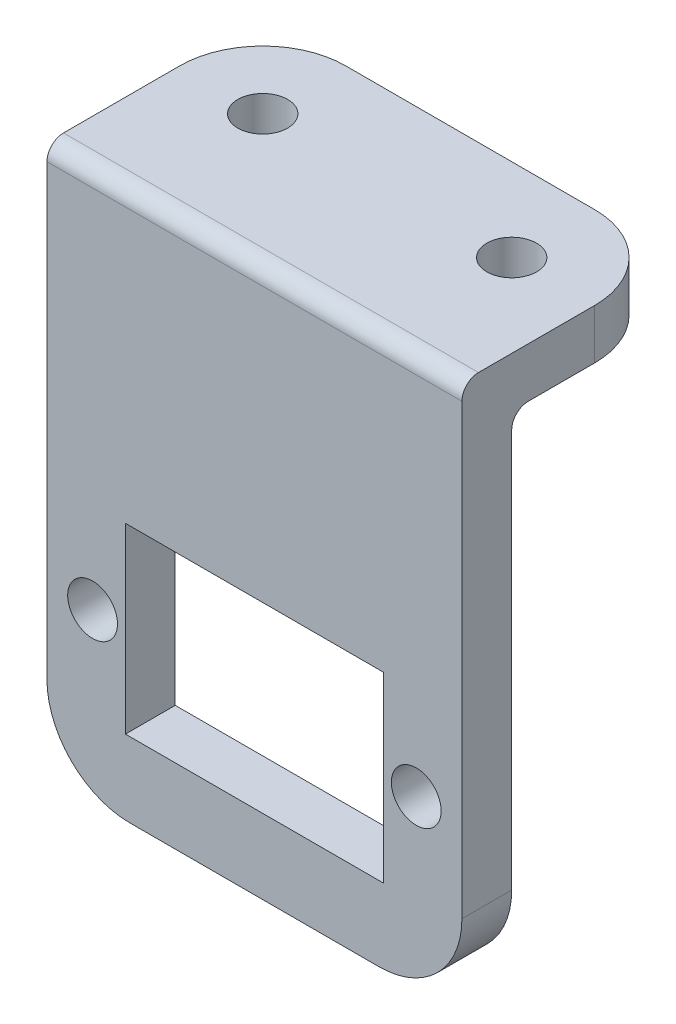
ISO-10303-21;
HEADER;
FILE_DESCRIPTION(('STEP AP214'),'2;1');
FILE_NAME('part.step','',(''),(''),'','','');
FILE_SCHEMA(('AUTOMOTIVE_DESIGN { 1 0 10303 214 1 1 1 1 }'));
ENDSEC;
DATA;
#1=APPLICATION_CONTEXT('core data for automotive mechanical design processes');
#2=APPLICATION_PROTOCOL_DEFINITION('international standard','automotive_design',2000,#1);
#3=PRODUCT_CONTEXT('',#1,'mechanical');
#4=PRODUCT('Part','Part','',(#3));
#5=PRODUCT_RELATED_PRODUCT_CATEGORY('part','',(#4));
#6=PRODUCT_DEFINITION_FORMATION('','',#4);
#7=PRODUCT_DEFINITION_CONTEXT('part definition',#1,'design');
#8=PRODUCT_DEFINITION('design','',#6,#7);
#9=PRODUCT_DEFINITION_SHAPE('','',#8);
#10=(LENGTH_UNIT() NAMED_UNIT(*) SI_UNIT(.MILLI.,.METRE.));
#11=(NAMED_UNIT(*) PLANE_ANGLE_UNIT() SI_UNIT($,.RADIAN.));
#12=(NAMED_UNIT(*) SI_UNIT($,.STERADIAN.) SOLID_ANGLE_UNIT());
#13=UNCERTAINTY_MEASURE_WITH_UNIT(LENGTH_MEASURE(1.E-05),#10,'distance_accuracy_value','');
#14=(GEOMETRIC_REPRESENTATION_CONTEXT(3) GLOBAL_UNCERTAINTY_ASSIGNED_CONTEXT((#13)) GLOBAL_UNIT_ASSIGNED_CONTEXT((#10,
#11,#12)) REPRESENTATION_CONTEXT('',''));
#15=CARTESIAN_POINT('',(0.,0.,0.));
#16=DIRECTION('',(0.,0.,1.));
#17=DIRECTION('',(1.,0.,0.));
#18=AXIS2_PLACEMENT_3D('',#15,#16,#17);
#19=CARTESIAN_POINT('',(0.,0.,-3.));
#20=DIRECTION('',(0.,0.,1.));
#21=DIRECTION('',(-1.,0.,0.));
#22=AXIS2_PLACEMENT_3D('',#19,#20,#21);
#23=PLANE('',#22);
#24=CARTESIAN_POINT('',(9.75,-5.,-3.));
#25=DIRECTION('',(0.,0.,1.));
#26=DIRECTION('',(1.,0.,0.));
#27=AXIS2_PLACEMENT_3D('',#24,#25,#26);
#28=CIRCLE('',#27,1.5);
#29=CARTESIAN_POINT('',(11.25,-5.,-3.));
#30=VERTEX_POINT('',#29);
#31=EDGE_CURVE('E199',#30,#30,#28,.T.);
#32=ORIENTED_EDGE('',*,*,#31,.T.);
#33=EDGE_LOOP('',(#32));
#34=FACE_BOUND('',#33,.T.);
#35=CARTESIAN_POINT('',(-9.75,-5.,-3.));
#36=DIRECTION('',(0.,0.,1.));
#37=DIRECTION('',(1.,0.,0.));
#38=AXIS2_PLACEMENT_3D('',#35,#36,#37);
#39=CIRCLE('',#38,1.5);
#40=CARTESIAN_POINT('',(-8.25,-5.,-3.));
#41=VERTEX_POINT('',#40);
#42=EDGE_CURVE('E205',#41,#41,#39,.T.);
#43=ORIENTED_EDGE('',*,*,#42,.T.);
#44=EDGE_LOOP('',(#43));
#45=FACE_BOUND('',#44,.T.);
#46=DIRECTION('',(1.,0.,0.));
#47=VECTOR('',#46,1.);
#48=CARTESIAN_POINT('',(-7.77000000000001,-10.5,-3.));
#49=LINE('',#48,#47);
#50=CARTESIAN_POINT('',(-7.77000000000001,-10.5,-3.));
#51=VERTEX_POINT('',#50);
#52=CARTESIAN_POINT('',(7.76999999999999,-10.5,-3.));
#53=VERTEX_POINT('',#52);
#54=EDGE_CURVE('E158',#51,#53,#49,.T.);
#55=ORIENTED_EDGE('',*,*,#54,.T.);
#56=DIRECTION('',(0.,1.,0.));
#57=VECTOR('',#56,1.);
#58=CARTESIAN_POINT('',(7.76999999999999,0.500000000000002,-3.));
#59=LINE('',#58,#57);
#60=CARTESIAN_POINT('',(7.76999999999999,0.500000000000002,-3.));
#61=VERTEX_POINT('',#60);
#62=EDGE_CURVE('E181',#53,#61,#59,.T.);
#63=ORIENTED_EDGE('',*,*,#62,.T.);
#64=DIRECTION('',(-1.,0.,0.));
#65=VECTOR('',#64,1.);
#66=CARTESIAN_POINT('',(-7.77000000000001,0.500000000000002,-3.));
#67=LINE('',#66,#65);
#68=CARTESIAN_POINT('',(-7.77000000000001,0.500000000000002,-3.));
#69=VERTEX_POINT('',#68);
#70=EDGE_CURVE('E178',#61,#69,#67,.T.);
#71=ORIENTED_EDGE('',*,*,#70,.T.);
#72=DIRECTION('',(0.,-1.,0.));
#73=VECTOR('',#72,1.);
#74=CARTESIAN_POINT('',(-7.77000000000001,0.500000000000002,-3.));
#75=LINE('',#74,#73);
#76=EDGE_CURVE('E189',#69,#51,#75,.T.);
#77=ORIENTED_EDGE('',*,*,#76,.T.);
#78=EDGE_LOOP('',(#55,#63,#71,#77));
#79=FACE_BOUND('',#78,.T.);
#80=DIRECTION('',(0.,1.,0.));
#81=VECTOR('',#80,1.);
#82=CARTESIAN_POINT('',(12.5,-15.,-3.));
#83=LINE('',#82,#81);
#84=CARTESIAN_POINT('',(12.5,-10.,-3.));
#85=VERTEX_POINT('',#84);
#86=CARTESIAN_POINT('',(12.5,14.,-3.));
#87=VERTEX_POINT('',#86);
#88=EDGE_CURVE('E211',#85,#87,#83,.T.);
#89=ORIENTED_EDGE('',*,*,#88,.F.);
#90=CARTESIAN_POINT('',(7.5,-10.,-3.));
#91=DIRECTION('',(0.,0.,-1.));
#92=DIRECTION('',(-1.,0.,0.));
#93=AXIS2_PLACEMENT_3D('',#90,#91,#92);
#94=CIRCLE('',#93,5.);
#95=CARTESIAN_POINT('',(7.5,-15.,-3.));
#96=VERTEX_POINT('',#95);
#97=EDGE_CURVE('E243',#96,#85,#94,.F.);
#98=ORIENTED_EDGE('',*,*,#97,.F.);
#99=DIRECTION('',(1.,0.,0.));
#100=VECTOR('',#99,1.);
#101=CARTESIAN_POINT('',(-12.5,-15.,-3.));
#102=LINE('',#101,#100);
#103=CARTESIAN_POINT('',(-7.5,-15.,-3.));
#104=VERTEX_POINT('',#103);
#105=EDGE_CURVE('E218',#104,#96,#102,.T.);
#106=ORIENTED_EDGE('',*,*,#105,.F.);
#107=CARTESIAN_POINT('',(-7.5,-10.,-3.));
#108=DIRECTION('',(0.,0.,-1.));
#109=DIRECTION('',(-1.,0.,0.));
#110=AXIS2_PLACEMENT_3D('',#107,#108,#109);
#111=CIRCLE('',#110,5.);
#112=CARTESIAN_POINT('',(-12.5,-10.,-3.));
#113=VERTEX_POINT('',#112);
#114=EDGE_CURVE('E240',#113,#104,#111,.F.);
#115=ORIENTED_EDGE('',*,*,#114,.F.);
#116=DIRECTION('',(0.,-1.,0.));
#117=VECTOR('',#116,1.);
#118=CARTESIAN_POINT('',(-12.5,-15.,-3.));
#119=LINE('',#118,#117);
#120=CARTESIAN_POINT('',(-12.5,14.,-3.));
#121=VERTEX_POINT('',#120);
#122=EDGE_CURVE('E214',#121,#113,#119,.T.);
#123=ORIENTED_EDGE('',*,*,#122,.F.);
#124=DIRECTION('',(1.,0.,0.));
#125=VECTOR('',#124,1.);
#126=CARTESIAN_POINT('',(-12.5,14.,-3.));
#127=LINE('',#126,#125);
#128=EDGE_CURVE('E270',#87,#121,#127,.F.);
#129=ORIENTED_EDGE('',*,*,#128,.F.);
#130=EDGE_LOOP('',(#89,#98,#106,#115,#123,#129));
#131=FACE_BOUND('',#130,.T.);
#132=ADVANCED_FACE('F39',(#34,#45,#79,#131),#23,.F.);
#133=CARTESIAN_POINT('',(0.,0.,0.));
#134=DIRECTION('',(0.,0.,1.));
#135=DIRECTION('',(-1.,0.,0.));
#136=AXIS2_PLACEMENT_3D('',#133,#134,#135);
#137=PLANE('',#136);
#138=DIRECTION('',(0.,-1.,0.));
#139=VECTOR('',#138,1.);
#140=CARTESIAN_POINT('',(-7.77000000000001,0.500000000000002,0.));
#141=LINE('',#140,#139);
#142=CARTESIAN_POINT('',(-7.77000000000001,0.500000000000002,0.));
#143=VERTEX_POINT('',#142);
#144=CARTESIAN_POINT('',(-7.77000000000001,-10.5,0.));
#145=VERTEX_POINT('',#144);
#146=EDGE_CURVE('E171',#143,#145,#141,.T.);
#147=ORIENTED_EDGE('',*,*,#146,.F.);
#148=DIRECTION('',(-1.,0.,0.));
#149=VECTOR('',#148,1.);
#150=CARTESIAN_POINT('',(-7.77000000000001,0.500000000000002,0.));
#151=LINE('',#150,#149);
#152=CARTESIAN_POINT('',(7.76999999999999,0.500000000000002,0.));
#153=VERTEX_POINT('',#152);
#154=EDGE_CURVE('E164',#153,#143,#151,.T.);
#155=ORIENTED_EDGE('',*,*,#154,.F.);
#156=DIRECTION('',(0.,1.,0.));
#157=VECTOR('',#156,1.);
#158=CARTESIAN_POINT('',(7.76999999999999,0.500000000000002,0.));
#159=LINE('',#158,#157);
#160=CARTESIAN_POINT('',(7.76999999999999,-10.5,0.));
#161=VERTEX_POINT('',#160);
#162=EDGE_CURVE('E173',#161,#153,#159,.T.);
#163=ORIENTED_EDGE('',*,*,#162,.F.);
#164=DIRECTION('',(1.,0.,0.));
#165=VECTOR('',#164,1.);
#166=CARTESIAN_POINT('',(-7.77000000000001,-10.5,0.));
#167=LINE('',#166,#165);
#168=EDGE_CURVE('E155',#145,#161,#167,.T.);
#169=ORIENTED_EDGE('',*,*,#168,.F.);
#170=EDGE_LOOP('',(#147,#155,#163,#169));
#171=FACE_BOUND('',#170,.T.);
#172=CARTESIAN_POINT('',(-9.75,-5.,0.));
#173=DIRECTION('',(0.,0.,1.));
#174=DIRECTION('',(1.,0.,0.));
#175=AXIS2_PLACEMENT_3D('',#172,#173,#174);
#176=CIRCLE('',#175,1.5);
#177=CARTESIAN_POINT('',(-8.25,-5.,0.));
#178=VERTEX_POINT('',#177);
#179=EDGE_CURVE('E202',#178,#178,#176,.T.);
#180=ORIENTED_EDGE('',*,*,#179,.F.);
#181=EDGE_LOOP('',(#180));
#182=FACE_BOUND('',#181,.T.);
#183=DIRECTION('',(0.,-1.,0.));
#184=VECTOR('',#183,1.);
#185=CARTESIAN_POINT('',(-12.5,-15.,0.));
#186=LINE('',#185,#184);
#187=CARTESIAN_POINT('',(-12.5,17.,0.));
#188=VERTEX_POINT('',#187);
#189=CARTESIAN_POINT('',(-12.5,-10.,0.));
#190=VERTEX_POINT('',#189);
#191=EDGE_CURVE('E224',#188,#190,#186,.T.);
#192=ORIENTED_EDGE('',*,*,#191,.T.);
#193=CARTESIAN_POINT('',(-7.5,-10.,0.));
#194=DIRECTION('',(0.,0.,-1.));
#195=DIRECTION('',(-1.,0.,0.));
#196=AXIS2_PLACEMENT_3D('',#193,#194,#195);
#197=CIRCLE('',#196,5.);
#198=CARTESIAN_POINT('',(-7.5,-15.,0.));
#199=VERTEX_POINT('',#198);
#200=EDGE_CURVE('E230',#199,#190,#197,.T.);
#201=ORIENTED_EDGE('',*,*,#200,.F.);
#202=DIRECTION('',(1.,0.,0.));
#203=VECTOR('',#202,1.);
#204=CARTESIAN_POINT('',(-12.5,-15.,0.));
#205=LINE('',#204,#203);
#206=CARTESIAN_POINT('',(7.5,-15.,0.));
#207=VERTEX_POINT('',#206);
#208=EDGE_CURVE('E215',#199,#207,#205,.T.);
#209=ORIENTED_EDGE('',*,*,#208,.T.);
#210=CARTESIAN_POINT('',(7.5,-10.,0.));
#211=DIRECTION('',(0.,0.,-1.));
#212=DIRECTION('',(-1.,0.,0.));
#213=AXIS2_PLACEMENT_3D('',#210,#211,#212);
#214=CIRCLE('',#213,5.);
#215=CARTESIAN_POINT('',(12.5,-10.,0.));
#216=VERTEX_POINT('',#215);
#217=EDGE_CURVE('E233',#216,#207,#214,.T.);
#218=ORIENTED_EDGE('',*,*,#217,.F.);
#219=DIRECTION('',(0.,1.,0.));
#220=VECTOR('',#219,1.);
#221=CARTESIAN_POINT('',(12.5,-15.,0.));
#222=LINE('',#221,#220);
#223=CARTESIAN_POINT('',(12.5,17.,0.));
#224=VERTEX_POINT('',#223);
#225=EDGE_CURVE('E208',#216,#224,#222,.T.);
#226=ORIENTED_EDGE('',*,*,#225,.T.);
#227=DIRECTION('',(-1.,0.,0.));
#228=VECTOR('',#227,1.);
#229=CARTESIAN_POINT('',(0.,17.,0.));
#230=LINE('',#229,#228);
#231=EDGE_CURVE('E47',#188,#224,#230,.F.);
#232=ORIENTED_EDGE('',*,*,#231,.F.);
#233=EDGE_LOOP('',(#192,#201,#209,#218,#226,#232));
#234=FACE_BOUND('',#233,.T.);
#235=CARTESIAN_POINT('',(9.75,-5.,0.));
#236=DIRECTION('',(0.,0.,1.));
#237=DIRECTION('',(1.,0.,0.));
#238=AXIS2_PLACEMENT_3D('',#235,#236,#237);
#239=CIRCLE('',#238,1.5);
#240=CARTESIAN_POINT('',(11.25,-5.,0.));
#241=VERTEX_POINT('',#240);
#242=EDGE_CURVE('E195',#241,#241,#239,.T.);
#243=ORIENTED_EDGE('',*,*,#242,.F.);
#244=EDGE_LOOP('',(#243));
#245=FACE_BOUND('',#244,.T.);
#246=ADVANCED_FACE('F168',(#171,#182,#234,#245),#137,.T.);
#247=CARTESIAN_POINT('',(12.5,-15.,-3.));
#248=DIRECTION('',(-1.,0.,0.));
#249=DIRECTION('',(0.,0.,-1.));
#250=AXIS2_PLACEMENT_3D('',#247,#248,#249);
#251=PLANE('',#250);
#252=ORIENTED_EDGE('',*,*,#225,.F.);
#253=DIRECTION('',(0.,0.,1.));
#254=VECTOR('',#253,1.);
#255=CARTESIAN_POINT('',(12.5,-10.,-3.));
#256=LINE('',#255,#254);
#257=EDGE_CURVE('E221',#85,#216,#256,.T.);
#258=ORIENTED_EDGE('',*,*,#257,.F.);
#259=ORIENTED_EDGE('',*,*,#88,.T.);
#260=CARTESIAN_POINT('',(12.5,14.,-4.));
#261=DIRECTION('',(1.,0.,0.));
#262=DIRECTION('',(0.,0.,-1.));
#263=AXIS2_PLACEMENT_3D('',#260,#261,#262);
#264=CIRCLE('',#263,1.);
#265=CARTESIAN_POINT('',(12.5,15.,-4.));
#266=VERTEX_POINT('',#265);
#267=EDGE_CURVE('E273',#266,#87,#264,.T.);
#268=ORIENTED_EDGE('',*,*,#267,.F.);
#269=DIRECTION('',(0.,0.,1.));
#270=VECTOR('',#269,1.);
#271=CARTESIAN_POINT('',(12.5,15.,-13.));
#272=LINE('',#271,#270);
#273=CARTESIAN_POINT('',(12.5,15.,-8.));
#274=VERTEX_POINT('',#273);
#275=EDGE_CURVE('E301',#274,#266,#272,.T.);
#276=ORIENTED_EDGE('',*,*,#275,.F.);
#277=DIRECTION('',(0.,1.,0.));
#278=VECTOR('',#277,1.);
#279=CARTESIAN_POINT('',(12.5,15.,-8.));
#280=LINE('',#279,#278);
#281=CARTESIAN_POINT('',(12.5,18.,-8.));
#282=VERTEX_POINT('',#281);
#283=EDGE_CURVE('E252',#282,#274,#280,.F.);
#284=ORIENTED_EDGE('',*,*,#283,.F.);
#285=DIRECTION('',(0.,0.,1.));
#286=VECTOR('',#285,1.);
#287=CARTESIAN_POINT('',(12.5,18.,-3.));
#288=LINE('',#287,#286);
#289=CARTESIAN_POINT('',(12.5,18.,-1.));
#290=VERTEX_POINT('',#289);
#291=EDGE_CURVE('E306',#282,#290,#288,.T.);
#292=ORIENTED_EDGE('',*,*,#291,.T.);
#293=CARTESIAN_POINT('',(12.5,17.,-1.));
#294=DIRECTION('',(1.,0.,0.));
#295=DIRECTION('',(0.,0.,-1.));
#296=AXIS2_PLACEMENT_3D('',#293,#294,#295);
#297=CIRCLE('',#296,1.);
#298=EDGE_CURVE('E11',#224,#290,#297,.F.);
#299=ORIENTED_EDGE('',*,*,#298,.F.);
#300=EDGE_LOOP('',(#252,#258,#259,#268,#276,#284,#292,#299));
#301=FACE_BOUND('',#300,.T.);
#302=ADVANCED_FACE('F284',(#301),#251,.F.);
#303=CARTESIAN_POINT('',(-12.5,-15.,-3.));
#304=DIRECTION('',(1.,0.,0.));
#305=DIRECTION('',(0.,0.,1.));
#306=AXIS2_PLACEMENT_3D('',#303,#304,#305);
#307=PLANE('',#306);
#308=DIRECTION('',(0.,0.,-1.));
#309=VECTOR('',#308,1.);
#310=CARTESIAN_POINT('',(-12.5,18.,0.));
#311=LINE('',#310,#309);
#312=CARTESIAN_POINT('',(-12.5,18.,-1.));
#313=VERTEX_POINT('',#312);
#314=CARTESIAN_POINT('',(-12.5,18.,-8.));
#315=VERTEX_POINT('',#314);
#316=EDGE_CURVE('E184',#313,#315,#311,.T.);
#317=ORIENTED_EDGE('',*,*,#316,.T.);
#318=DIRECTION('',(0.,-1.,0.));
#319=VECTOR('',#318,1.);
#320=CARTESIAN_POINT('',(-12.5,18.,-8.));
#321=LINE('',#320,#319);
#322=CARTESIAN_POINT('',(-12.5,15.,-8.));
#323=VERTEX_POINT('',#322);
#324=EDGE_CURVE('E262',#323,#315,#321,.F.);
#325=ORIENTED_EDGE('',*,*,#324,.F.);
#326=DIRECTION('',(0.,0.,1.));
#327=VECTOR('',#326,1.);
#328=CARTESIAN_POINT('',(-12.5,15.,-13.));
#329=LINE('',#328,#327);
#330=CARTESIAN_POINT('',(-12.5,15.,-4.));
#331=VERTEX_POINT('',#330);
#332=EDGE_CURVE('E303',#323,#331,#329,.T.);
#333=ORIENTED_EDGE('',*,*,#332,.T.);
#334=CARTESIAN_POINT('',(-12.5,14.,-4.));
#335=DIRECTION('',(-1.,0.,0.));
#336=DIRECTION('',(0.,0.,1.));
#337=AXIS2_PLACEMENT_3D('',#334,#335,#336);
#338=CIRCLE('',#337,1.);
#339=EDGE_CURVE('E275',#121,#331,#338,.T.);
#340=ORIENTED_EDGE('',*,*,#339,.F.);
#341=ORIENTED_EDGE('',*,*,#122,.T.);
#342=DIRECTION('',(0.,0.,1.));
#343=VECTOR('',#342,1.);
#344=CARTESIAN_POINT('',(-12.5,-10.,-3.));
#345=LINE('',#344,#343);
#346=EDGE_CURVE('E246',#190,#113,#345,.F.);
#347=ORIENTED_EDGE('',*,*,#346,.F.);
#348=ORIENTED_EDGE('',*,*,#191,.F.);
#349=CARTESIAN_POINT('',(-12.5,17.,-1.));
#350=DIRECTION('',(-1.,0.,0.));
#351=DIRECTION('',(0.,0.,1.));
#352=AXIS2_PLACEMENT_3D('',#349,#350,#351);
#353=CIRCLE('',#352,1.);
#354=EDGE_CURVE('E59',#313,#188,#353,.F.);
#355=ORIENTED_EDGE('',*,*,#354,.F.);
#356=EDGE_LOOP('',(#317,#325,#333,#340,#341,#347,#348,#355));
#357=FACE_BOUND('',#356,.T.);
#358=ADVANCED_FACE('F317',(#357),#307,.F.);
#359=CARTESIAN_POINT('',(-12.5,-15.,-3.));
#360=DIRECTION('',(0.,1.,0.));
#361=DIRECTION('',(0.,0.,-1.));
#362=AXIS2_PLACEMENT_3D('',#359,#360,#361);
#363=PLANE('',#362);
#364=ORIENTED_EDGE('',*,*,#208,.F.);
#365=DIRECTION('',(0.,0.,1.));
#366=VECTOR('',#365,1.);
#367=CARTESIAN_POINT('',(-7.5,-15.,-3.));
#368=LINE('',#367,#366);
#369=EDGE_CURVE('E236',#104,#199,#368,.T.);
#370=ORIENTED_EDGE('',*,*,#369,.F.);
#371=ORIENTED_EDGE('',*,*,#105,.T.);
#372=DIRECTION('',(0.,0.,1.));
#373=VECTOR('',#372,1.);
#374=CARTESIAN_POINT('',(7.5,-15.,-3.));
#375=LINE('',#374,#373);
#376=EDGE_CURVE('E238',#207,#96,#375,.F.);
#377=ORIENTED_EDGE('',*,*,#376,.F.);
#378=EDGE_LOOP('',(#364,#370,#371,#377));
#379=FACE_BOUND('',#378,.T.);
#380=ADVANCED_FACE('F334',(#379),#363,.F.);
#381=CARTESIAN_POINT('',(-9.75,-5.,-3.));
#382=DIRECTION('',(0.,0.,1.));
#383=DIRECTION('',(-1.,0.,0.));
#384=AXIS2_PLACEMENT_3D('',#381,#382,#383);
#385=CYLINDRICAL_SURFACE('',#384,1.5);
#386=ORIENTED_EDGE('',*,*,#42,.F.);
#387=EDGE_LOOP('',(#386));
#388=FACE_BOUND('',#387,.T.);
#389=ORIENTED_EDGE('',*,*,#179,.T.);
#390=EDGE_LOOP('',(#389));
#391=FACE_BOUND('',#390,.T.);
#392=ADVANCED_FACE('F336',(#388,#391),#385,.F.);
#393=CARTESIAN_POINT('',(9.75,-5.,-3.));
#394=DIRECTION('',(0.,0.,1.));
#395=DIRECTION('',(-1.,0.,0.));
#396=AXIS2_PLACEMENT_3D('',#393,#394,#395);
#397=CYLINDRICAL_SURFACE('',#396,1.5);
#398=ORIENTED_EDGE('',*,*,#31,.F.);
#399=EDGE_LOOP('',(#398));
#400=FACE_BOUND('',#399,.T.);
#401=ORIENTED_EDGE('',*,*,#242,.T.);
#402=EDGE_LOOP('',(#401));
#403=FACE_BOUND('',#402,.T.);
#404=ADVANCED_FACE('F342',(#400,#403),#397,.F.);
#405=CARTESIAN_POINT('',(-7.77000000000001,0.500000000000002,0.));
#406=DIRECTION('',(-1.,0.,0.));
#407=DIRECTION('',(0.,-1.,0.));
#408=AXIS2_PLACEMENT_3D('',#405,#406,#407);
#409=PLANE('',#408);
#410=ORIENTED_EDGE('',*,*,#76,.F.);
#411=DIRECTION('',(0.,0.,-1.));
#412=VECTOR('',#411,1.);
#413=CARTESIAN_POINT('',(-7.77000000000001,0.500000000000002,0.));
#414=LINE('',#413,#412);
#415=EDGE_CURVE('E176',#143,#69,#414,.T.);
#416=ORIENTED_EDGE('',*,*,#415,.F.);
#417=ORIENTED_EDGE('',*,*,#146,.T.);
#418=DIRECTION('',(0.,0.,-1.));
#419=VECTOR('',#418,1.);
#420=CARTESIAN_POINT('',(-7.77000000000001,-10.5,0.));
#421=LINE('',#420,#419);
#422=EDGE_CURVE('E152',#145,#51,#421,.T.);
#423=ORIENTED_EDGE('',*,*,#422,.T.);
#424=EDGE_LOOP('',(#410,#416,#417,#423));
#425=FACE_BOUND('',#424,.T.);
#426=ADVANCED_FACE('F175',(#425),#409,.F.);
#427=CARTESIAN_POINT('',(-7.77000000000001,0.500000000000002,0.));
#428=DIRECTION('',(0.,1.,0.));
#429=DIRECTION('',(0.,0.,-1.));
#430=AXIS2_PLACEMENT_3D('',#427,#428,#429);
#431=PLANE('',#430);
#432=ORIENTED_EDGE('',*,*,#70,.F.);
#433=DIRECTION('',(0.,0.,-1.));
#434=VECTOR('',#433,1.);
#435=CARTESIAN_POINT('',(7.76999999999999,0.500000000000002,0.));
#436=LINE('',#435,#434);
#437=EDGE_CURVE('E196',#153,#61,#436,.T.);
#438=ORIENTED_EDGE('',*,*,#437,.F.);
#439=ORIENTED_EDGE('',*,*,#154,.T.);
#440=ORIENTED_EDGE('',*,*,#415,.T.);
#441=EDGE_LOOP('',(#432,#438,#439,#440));
#442=FACE_BOUND('',#441,.T.);
#443=ADVANCED_FACE('F360',(#442),#431,.F.);
#444=CARTESIAN_POINT('',(7.76999999999999,0.500000000000002,0.));
#445=DIRECTION('',(1.,0.,0.));
#446=DIRECTION('',(0.,1.,0.));
#447=AXIS2_PLACEMENT_3D('',#444,#445,#446);
#448=PLANE('',#447);
#449=ORIENTED_EDGE('',*,*,#62,.F.);
#450=DIRECTION('',(0.,0.,-1.));
#451=VECTOR('',#450,1.);
#452=CARTESIAN_POINT('',(7.76999999999999,-10.5,0.));
#453=LINE('',#452,#451);
#454=EDGE_CURVE('E163',#161,#53,#453,.T.);
#455=ORIENTED_EDGE('',*,*,#454,.F.);
#456=ORIENTED_EDGE('',*,*,#162,.T.);
#457=ORIENTED_EDGE('',*,*,#437,.T.);
#458=EDGE_LOOP('',(#449,#455,#456,#457));
#459=FACE_BOUND('',#458,.T.);
#460=ADVANCED_FACE('F363',(#459),#448,.F.);
#461=CARTESIAN_POINT('',(-7.77000000000001,-10.5,0.));
#462=DIRECTION('',(0.,-1.,0.));
#463=DIRECTION('',(0.,0.,1.));
#464=AXIS2_PLACEMENT_3D('',#461,#462,#463);
#465=PLANE('',#464);
#466=ORIENTED_EDGE('',*,*,#54,.F.);
#467=ORIENTED_EDGE('',*,*,#422,.F.);
#468=ORIENTED_EDGE('',*,*,#168,.T.);
#469=ORIENTED_EDGE('',*,*,#454,.T.);
#470=EDGE_LOOP('',(#466,#467,#468,#469));
#471=FACE_BOUND('',#470,.T.);
#472=ADVANCED_FACE('F154',(#471),#465,.F.);
#473=CARTESIAN_POINT('',(7.5,-10.,-3.));
#474=DIRECTION('',(0.,0.,1.));
#475=DIRECTION('',(-1.,0.,0.));
#476=AXIS2_PLACEMENT_3D('',#473,#474,#475);
#477=CYLINDRICAL_SURFACE('',#476,5.);
#478=ORIENTED_EDGE('',*,*,#97,.T.);
#479=ORIENTED_EDGE('',*,*,#257,.T.);
#480=ORIENTED_EDGE('',*,*,#217,.T.);
#481=ORIENTED_EDGE('',*,*,#376,.T.);
#482=EDGE_LOOP('',(#478,#479,#480,#481));
#483=FACE_BOUND('',#482,.T.);
#484=ADVANCED_FACE('F289',(#483),#477,.T.);
#485=CARTESIAN_POINT('',(-7.5,-10.,-3.));
#486=DIRECTION('',(0.,0.,1.));
#487=DIRECTION('',(-1.,0.,0.));
#488=AXIS2_PLACEMENT_3D('',#485,#486,#487);
#489=CYLINDRICAL_SURFACE('',#488,5.);
#490=ORIENTED_EDGE('',*,*,#114,.T.);
#491=ORIENTED_EDGE('',*,*,#369,.T.);
#492=ORIENTED_EDGE('',*,*,#200,.T.);
#493=ORIENTED_EDGE('',*,*,#346,.T.);
#494=EDGE_LOOP('',(#490,#491,#492,#493));
#495=FACE_BOUND('',#494,.T.);
#496=ADVANCED_FACE('F330',(#495),#489,.T.);
#497=CARTESIAN_POINT('',(0.,18.,0.));
#498=DIRECTION('',(0.,1.,0.));
#499=DIRECTION('',(0.,0.,-1.));
#500=AXIS2_PLACEMENT_3D('',#497,#498,#499);
#501=PLANE('',#500);
#502=CARTESIAN_POINT('',(-7.5,18.,-8.));
#503=DIRECTION('',(0.,1.,0.));
#504=DIRECTION('',(0.,0.,1.));
#505=AXIS2_PLACEMENT_3D('',#502,#503,#504);
#506=CIRCLE('',#505,1.5);
#507=CARTESIAN_POINT('',(-7.5,18.,-6.5));
#508=VERTEX_POINT('',#507);
#509=EDGE_CURVE('E394',#508,#508,#506,.T.);
#510=ORIENTED_EDGE('',*,*,#509,.F.);
#511=EDGE_LOOP('',(#510));
#512=FACE_BOUND('',#511,.T.);
#513=CARTESIAN_POINT('',(7.5,18.,-8.));
#514=DIRECTION('',(0.,1.,0.));
#515=DIRECTION('',(0.,0.,1.));
#516=AXIS2_PLACEMENT_3D('',#513,#514,#515);
#517=CIRCLE('',#516,1.5);
#518=CARTESIAN_POINT('',(7.5,18.,-6.5));
#519=VERTEX_POINT('',#518);
#520=EDGE_CURVE('E402',#519,#519,#517,.T.);
#521=ORIENTED_EDGE('',*,*,#520,.F.);
#522=EDGE_LOOP('',(#521));
#523=FACE_BOUND('',#522,.T.);
#524=ORIENTED_EDGE('',*,*,#291,.F.);
#525=CARTESIAN_POINT('',(7.5,18.,-8.));
#526=DIRECTION('',(0.,-1.,0.));
#527=DIRECTION('',(0.,0.,-1.));
#528=AXIS2_PLACEMENT_3D('',#525,#526,#527);
#529=CIRCLE('',#528,5.);
#530=CARTESIAN_POINT('',(7.5,18.,-13.));
#531=VERTEX_POINT('',#530);
#532=EDGE_CURVE('E250',#531,#282,#529,.T.);
#533=ORIENTED_EDGE('',*,*,#532,.F.);
#534=DIRECTION('',(-1.,0.,0.));
#535=VECTOR('',#534,1.);
#536=CARTESIAN_POINT('',(-12.5,18.,-13.));
#537=LINE('',#536,#535);
#538=CARTESIAN_POINT('',(-7.5,18.,-13.));
#539=VERTEX_POINT('',#538);
#540=EDGE_CURVE('E304',#531,#539,#537,.T.);
#541=ORIENTED_EDGE('',*,*,#540,.T.);
#542=CARTESIAN_POINT('',(-7.5,18.,-8.));
#543=DIRECTION('',(0.,-1.,0.));
#544=DIRECTION('',(0.,0.,-1.));
#545=AXIS2_PLACEMENT_3D('',#542,#543,#544);
#546=CIRCLE('',#545,5.);
#547=EDGE_CURVE('E265',#315,#539,#546,.T.);
#548=ORIENTED_EDGE('',*,*,#547,.F.);
#549=ORIENTED_EDGE('',*,*,#316,.F.);
#550=DIRECTION('',(-1.,0.,0.));
#551=VECTOR('',#550,1.);
#552=CARTESIAN_POINT('',(0.,18.,-1.));
#553=LINE('',#552,#551);
#554=EDGE_CURVE('E278',#290,#313,#553,.T.);
#555=ORIENTED_EDGE('',*,*,#554,.F.);
#556=EDGE_LOOP('',(#524,#533,#541,#548,#549,#555));
#557=FACE_BOUND('',#556,.T.);
#558=ADVANCED_FACE('F319',(#512,#523,#557),#501,.T.);
#559=CARTESIAN_POINT('',(-12.5,15.,-13.));
#560=DIRECTION('',(0.,1.,0.));
#561=DIRECTION('',(0.,0.,-1.));
#562=AXIS2_PLACEMENT_3D('',#559,#560,#561);
#563=PLANE('',#562);
#564=CARTESIAN_POINT('',(-7.5,15.,-8.));
#565=DIRECTION('',(0.,1.,0.));
#566=DIRECTION('',(0.,0.,1.));
#567=AXIS2_PLACEMENT_3D('',#564,#565,#566);
#568=CIRCLE('',#567,1.5);
#569=CARTESIAN_POINT('',(-7.5,15.,-6.5));
#570=VERTEX_POINT('',#569);
#571=EDGE_CURVE('E397',#570,#570,#568,.T.);
#572=ORIENTED_EDGE('',*,*,#571,.T.);
#573=EDGE_LOOP('',(#572));
#574=FACE_BOUND('',#573,.T.);
#575=CARTESIAN_POINT('',(7.5,15.,-8.));
#576=DIRECTION('',(0.,1.,0.));
#577=DIRECTION('',(0.,0.,1.));
#578=AXIS2_PLACEMENT_3D('',#575,#576,#577);
#579=CIRCLE('',#578,1.5);
#580=CARTESIAN_POINT('',(7.5,15.,-6.5));
#581=VERTEX_POINT('',#580);
#582=EDGE_CURVE('E398',#581,#581,#579,.T.);
#583=ORIENTED_EDGE('',*,*,#582,.T.);
#584=EDGE_LOOP('',(#583));
#585=FACE_BOUND('',#584,.T.);
#586=ORIENTED_EDGE('',*,*,#332,.F.);
#587=CARTESIAN_POINT('',(-7.5,15.,-8.));
#588=DIRECTION('',(0.,-1.,0.));
#589=DIRECTION('',(0.,0.,-1.));
#590=AXIS2_PLACEMENT_3D('',#587,#588,#589);
#591=CIRCLE('',#590,5.);
#592=CARTESIAN_POINT('',(-7.5,15.,-13.));
#593=VERTEX_POINT('',#592);
#594=EDGE_CURVE('E260',#593,#323,#591,.F.);
#595=ORIENTED_EDGE('',*,*,#594,.F.);
#596=DIRECTION('',(1.,0.,0.));
#597=VECTOR('',#596,1.);
#598=CARTESIAN_POINT('',(-12.5,15.,-13.));
#599=LINE('',#598,#597);
#600=CARTESIAN_POINT('',(7.5,15.,-13.));
#601=VERTEX_POINT('',#600);
#602=EDGE_CURVE('E309',#593,#601,#599,.T.);
#603=ORIENTED_EDGE('',*,*,#602,.T.);
#604=CARTESIAN_POINT('',(7.5,15.,-8.));
#605=DIRECTION('',(0.,-1.,0.));
#606=DIRECTION('',(0.,0.,-1.));
#607=AXIS2_PLACEMENT_3D('',#604,#605,#606);
#608=CIRCLE('',#607,5.);
#609=EDGE_CURVE('E255',#274,#601,#608,.F.);
#610=ORIENTED_EDGE('',*,*,#609,.F.);
#611=ORIENTED_EDGE('',*,*,#275,.T.);
#612=DIRECTION('',(1.,0.,0.));
#613=VECTOR('',#612,1.);
#614=CARTESIAN_POINT('',(12.5,15.,-4.));
#615=LINE('',#614,#613);
#616=EDGE_CURVE('E268',#331,#266,#615,.T.);
#617=ORIENTED_EDGE('',*,*,#616,.F.);
#618=EDGE_LOOP('',(#586,#595,#603,#610,#611,#617));
#619=FACE_BOUND('',#618,.T.);
#620=ADVANCED_FACE('F328',(#574,#585,#619),#563,.F.);
#621=CARTESIAN_POINT('',(0.,0.,-13.));
#622=DIRECTION('',(0.,0.,-1.));
#623=DIRECTION('',(1.,0.,0.));
#624=AXIS2_PLACEMENT_3D('',#621,#622,#623);
#625=PLANE('',#624);
#626=ORIENTED_EDGE('',*,*,#540,.F.);
#627=DIRECTION('',(0.,1.,0.));
#628=VECTOR('',#627,1.);
#629=CARTESIAN_POINT('',(7.5,18.,-13.));
#630=LINE('',#629,#628);
#631=EDGE_CURVE('E248',#601,#531,#630,.T.);
#632=ORIENTED_EDGE('',*,*,#631,.F.);
#633=ORIENTED_EDGE('',*,*,#602,.F.);
#634=DIRECTION('',(0.,-1.,0.));
#635=VECTOR('',#634,1.);
#636=CARTESIAN_POINT('',(-7.5,15.,-13.));
#637=LINE('',#636,#635);
#638=EDGE_CURVE('E258',#539,#593,#637,.T.);
#639=ORIENTED_EDGE('',*,*,#638,.F.);
#640=EDGE_LOOP('',(#626,#632,#633,#639));
#641=FACE_BOUND('',#640,.T.);
#642=ADVANCED_FACE('F375',(#641),#625,.T.);
#643=CARTESIAN_POINT('',(7.5,0.,-8.));
#644=DIRECTION('',(0.,-1.,0.));
#645=DIRECTION('',(0.,0.,1.));
#646=AXIS2_PLACEMENT_3D('',#643,#644,#645);
#647=CYLINDRICAL_SURFACE('',#646,5.);
#648=ORIENTED_EDGE('',*,*,#609,.T.);
#649=ORIENTED_EDGE('',*,*,#631,.T.);
#650=ORIENTED_EDGE('',*,*,#532,.T.);
#651=ORIENTED_EDGE('',*,*,#283,.T.);
#652=EDGE_LOOP('',(#648,#649,#650,#651));
#653=FACE_BOUND('',#652,.T.);
#654=ADVANCED_FACE('F379',(#653),#647,.T.);
#655=CARTESIAN_POINT('',(-7.5,0.,-8.));
#656=DIRECTION('',(0.,1.,0.));
#657=DIRECTION('',(0.,0.,-1.));
#658=AXIS2_PLACEMENT_3D('',#655,#656,#657);
#659=CYLINDRICAL_SURFACE('',#658,5.);
#660=ORIENTED_EDGE('',*,*,#547,.T.);
#661=ORIENTED_EDGE('',*,*,#638,.T.);
#662=ORIENTED_EDGE('',*,*,#594,.T.);
#663=ORIENTED_EDGE('',*,*,#324,.T.);
#664=EDGE_LOOP('',(#660,#661,#662,#663));
#665=FACE_BOUND('',#664,.T.);
#666=ADVANCED_FACE('F323',(#665),#659,.T.);
#667=CARTESIAN_POINT('',(7.5,18.,-8.));
#668=DIRECTION('',(0.,-1.,0.));
#669=DIRECTION('',(0.,0.,1.));
#670=AXIS2_PLACEMENT_3D('',#667,#668,#669);
#671=CYLINDRICAL_SURFACE('',#670,1.5);
#672=ORIENTED_EDGE('',*,*,#520,.T.);
#673=EDGE_LOOP('',(#672));
#674=FACE_BOUND('',#673,.T.);
#675=ORIENTED_EDGE('',*,*,#582,.F.);
#676=EDGE_LOOP('',(#675));
#677=FACE_BOUND('',#676,.T.);
#678=ADVANCED_FACE('F381',(#674,#677),#671,.F.);
#679=CARTESIAN_POINT('',(-7.5,18.,-8.));
#680=DIRECTION('',(0.,-1.,0.));
#681=DIRECTION('',(0.,0.,1.));
#682=AXIS2_PLACEMENT_3D('',#679,#680,#681);
#683=CYLINDRICAL_SURFACE('',#682,1.5);
#684=ORIENTED_EDGE('',*,*,#509,.T.);
#685=EDGE_LOOP('',(#684));
#686=FACE_BOUND('',#685,.T.);
#687=ORIENTED_EDGE('',*,*,#571,.F.);
#688=EDGE_LOOP('',(#687));
#689=FACE_BOUND('',#688,.T.);
#690=ADVANCED_FACE('F384',(#686,#689),#683,.F.);
#691=CARTESIAN_POINT('',(-12.5,14.,-4.));
#692=DIRECTION('',(-1.,0.,0.));
#693=DIRECTION('',(0.,0.,-1.));
#694=AXIS2_PLACEMENT_3D('',#691,#692,#693);
#695=CYLINDRICAL_SURFACE('',#694,1.);
#696=ORIENTED_EDGE('',*,*,#339,.T.);
#697=ORIENTED_EDGE('',*,*,#616,.T.);
#698=ORIENTED_EDGE('',*,*,#267,.T.);
#699=ORIENTED_EDGE('',*,*,#128,.T.);
#700=EDGE_LOOP('',(#696,#697,#698,#699));
#701=FACE_BOUND('',#700,.T.);
#702=ADVANCED_FACE('F296',(#701),#695,.F.);
#703=CARTESIAN_POINT('',(0.,17.,-1.));
#704=DIRECTION('',(-1.,0.,0.));
#705=DIRECTION('',(0.,0.,-1.));
#706=AXIS2_PLACEMENT_3D('',#703,#704,#705);
#707=CYLINDRICAL_SURFACE('',#706,1.);
#708=ORIENTED_EDGE('',*,*,#298,.T.);
#709=ORIENTED_EDGE('',*,*,#554,.T.);
#710=ORIENTED_EDGE('',*,*,#354,.T.);
#711=ORIENTED_EDGE('',*,*,#231,.T.);
#712=EDGE_LOOP('',(#708,#709,#710,#711));
#713=FACE_BOUND('',#712,.T.);
#714=ADVANCED_FACE('F41',(#713),#707,.T.);
#715=CLOSED_SHELL('',(#132,#246,#302,#358,#380,#392,#404,#426,#443,#460,#472,#484,#496,#558,
#620,#642,#654,#666,#678,#690,#702,#714));
#716=MANIFOLD_SOLID_BREP('B2',#715);
#717=ADVANCED_BREP_SHAPE_REPRESENTATION('',(#18,#716),#14);
#718=SHAPE_DEFINITION_REPRESENTATION(#9,#717);
ENDSEC;
END-ISO-10303-21;
